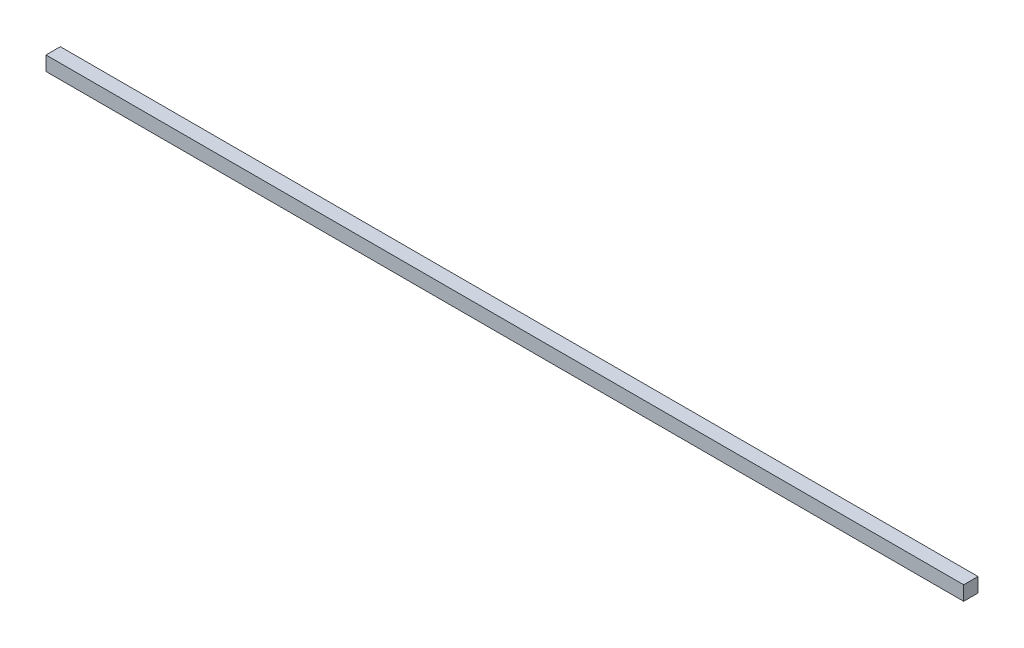
ISO-10303-21;
HEADER;
FILE_DESCRIPTION(('STEP AP214'),'2;1');
FILE_NAME('part.step','',(''),(''),'','','');
FILE_SCHEMA(('AUTOMOTIVE_DESIGN { 1 0 10303 214 1 1 1 1 }'));
ENDSEC;
DATA;
#1=APPLICATION_CONTEXT('core data for automotive mechanical design processes');
#2=APPLICATION_PROTOCOL_DEFINITION('international standard','automotive_design',2000,#1);
#3=PRODUCT_CONTEXT('',#1,'mechanical');
#4=PRODUCT('Part','Part','',(#3));
#5=PRODUCT_RELATED_PRODUCT_CATEGORY('part','',(#4));
#6=PRODUCT_DEFINITION_FORMATION('','',#4);
#7=PRODUCT_DEFINITION_CONTEXT('part definition',#1,'design');
#8=PRODUCT_DEFINITION('design','',#6,#7);
#9=PRODUCT_DEFINITION_SHAPE('','',#8);
#10=(LENGTH_UNIT() NAMED_UNIT(*) SI_UNIT(.MILLI.,.METRE.));
#11=(NAMED_UNIT(*) PLANE_ANGLE_UNIT() SI_UNIT($,.RADIAN.));
#12=(NAMED_UNIT(*) SI_UNIT($,.STERADIAN.) SOLID_ANGLE_UNIT());
#13=UNCERTAINTY_MEASURE_WITH_UNIT(LENGTH_MEASURE(1.E-05),#10,'distance_accuracy_value','');
#14=(GEOMETRIC_REPRESENTATION_CONTEXT(3) GLOBAL_UNCERTAINTY_ASSIGNED_CONTEXT((#13)) GLOBAL_UNIT_ASSIGNED_CONTEXT((#10,
#11,#12)) REPRESENTATION_CONTEXT('',''));
#15=CARTESIAN_POINT('',(0.,0.,0.));
#16=DIRECTION('',(0.,0.,1.));
#17=DIRECTION('',(1.,0.,0.));
#18=AXIS2_PLACEMENT_3D('',#15,#16,#17);
#19=CARTESIAN_POINT('',(-1219.2,19.0500000000001,38.1));
#20=DIRECTION('',(1.,0.,0.));
#21=DIRECTION('',(0.,0.,-1.));
#22=AXIS2_PLACEMENT_3D('',#19,#20,#21);
#23=PLANE('',#22);
#24=DIRECTION('',(0.,-1.,0.));
#25=VECTOR('',#24,1.);
#26=CARTESIAN_POINT('',(-1219.2,19.0500000000001,0.));
#27=LINE('',#26,#25);
#28=CARTESIAN_POINT('',(-1219.2,19.0500000000001,0.));
#29=VERTEX_POINT('',#28);
#30=CARTESIAN_POINT('',(-1219.2,-19.0500000000001,0.));
#31=VERTEX_POINT('',#30);
#32=EDGE_CURVE('E95',#29,#31,#27,.T.);
#33=ORIENTED_EDGE('',*,*,#32,.T.);
#34=DIRECTION('',(0.,0.,-1.));
#35=VECTOR('',#34,1.);
#36=CARTESIAN_POINT('',(-1219.2,-19.0500000000001,38.1));
#37=LINE('',#36,#35);
#38=CARTESIAN_POINT('',(-1219.2,-19.0500000000001,38.1));
#39=VERTEX_POINT('',#38);
#40=EDGE_CURVE('E11',#39,#31,#37,.T.);
#41=ORIENTED_EDGE('',*,*,#40,.F.);
#42=DIRECTION('',(0.,-1.,0.));
#43=VECTOR('',#42,1.);
#44=CARTESIAN_POINT('',(-1219.2,19.0500000000001,38.1));
#45=LINE('',#44,#43);
#46=CARTESIAN_POINT('',(-1219.2,19.0500000000001,38.1));
#47=VERTEX_POINT('',#46);
#48=EDGE_CURVE('E83',#47,#39,#45,.T.);
#49=ORIENTED_EDGE('',*,*,#48,.F.);
#50=DIRECTION('',(0.,0.,-1.));
#51=VECTOR('',#50,1.);
#52=CARTESIAN_POINT('',(-1219.2,19.0500000000001,38.1));
#53=LINE('',#52,#51);
#54=EDGE_CURVE('E91',#47,#29,#53,.T.);
#55=ORIENTED_EDGE('',*,*,#54,.T.);
#56=EDGE_LOOP('',(#33,#41,#49,#55));
#57=FACE_BOUND('',#56,.T.);
#58=ADVANCED_FACE('F32',(#57),#23,.F.);
#59=CARTESIAN_POINT('',(-1219.2,-19.0500000000001,38.1));
#60=DIRECTION('',(0.,1.,0.));
#61=DIRECTION('',(-1.,0.,0.));
#62=AXIS2_PLACEMENT_3D('',#59,#60,#61);
#63=PLANE('',#62);
#64=DIRECTION('',(1.,0.,0.));
#65=VECTOR('',#64,1.);
#66=CARTESIAN_POINT('',(-1219.2,-19.0500000000001,0.));
#67=LINE('',#66,#65);
#68=CARTESIAN_POINT('',(1219.2,-19.05,0.));
#69=VERTEX_POINT('',#68);
#70=EDGE_CURVE('E87',#31,#69,#67,.T.);
#71=ORIENTED_EDGE('',*,*,#70,.T.);
#72=DIRECTION('',(0.,0.,-1.));
#73=VECTOR('',#72,1.);
#74=CARTESIAN_POINT('',(1219.2,-19.05,38.1));
#75=LINE('',#74,#73);
#76=CARTESIAN_POINT('',(1219.2,-19.05,38.1));
#77=VERTEX_POINT('',#76);
#78=EDGE_CURVE('E40',#77,#69,#75,.T.);
#79=ORIENTED_EDGE('',*,*,#78,.F.);
#80=DIRECTION('',(1.,0.,0.));
#81=VECTOR('',#80,1.);
#82=CARTESIAN_POINT('',(-1219.2,-19.0500000000001,38.1));
#83=LINE('',#82,#81);
#84=EDGE_CURVE('E78',#39,#77,#83,.T.);
#85=ORIENTED_EDGE('',*,*,#84,.F.);
#86=ORIENTED_EDGE('',*,*,#40,.T.);
#87=EDGE_LOOP('',(#71,#79,#85,#86));
#88=FACE_BOUND('',#87,.T.);
#89=ADVANCED_FACE('F86',(#88),#63,.F.);
#90=CARTESIAN_POINT('',(1219.2,19.05,38.1));
#91=DIRECTION('',(-1.,0.,0.));
#92=DIRECTION('',(0.,0.,1.));
#93=AXIS2_PLACEMENT_3D('',#90,#91,#92);
#94=PLANE('',#93);
#95=DIRECTION('',(0.,1.,0.));
#96=VECTOR('',#95,1.);
#97=CARTESIAN_POINT('',(1219.2,19.05,0.));
#98=LINE('',#97,#96);
#99=CARTESIAN_POINT('',(1219.2,19.05,0.));
#100=VERTEX_POINT('',#99);
#101=EDGE_CURVE('E65',#69,#100,#98,.T.);
#102=ORIENTED_EDGE('',*,*,#101,.T.);
#103=DIRECTION('',(0.,0.,-1.));
#104=VECTOR('',#103,1.);
#105=CARTESIAN_POINT('',(1219.2,19.05,38.1));
#106=LINE('',#105,#104);
#107=CARTESIAN_POINT('',(1219.2,19.05,38.1));
#108=VERTEX_POINT('',#107);
#109=EDGE_CURVE('E88',#108,#100,#106,.T.);
#110=ORIENTED_EDGE('',*,*,#109,.F.);
#111=DIRECTION('',(0.,1.,0.));
#112=VECTOR('',#111,1.);
#113=CARTESIAN_POINT('',(1219.2,19.05,38.1));
#114=LINE('',#113,#112);
#115=EDGE_CURVE('E81',#77,#108,#114,.T.);
#116=ORIENTED_EDGE('',*,*,#115,.F.);
#117=ORIENTED_EDGE('',*,*,#78,.T.);
#118=EDGE_LOOP('',(#102,#110,#116,#117));
#119=FACE_BOUND('',#118,.T.);
#120=ADVANCED_FACE('F89',(#119),#94,.F.);
#121=CARTESIAN_POINT('',(-1219.2,19.0500000000001,38.1));
#122=DIRECTION('',(0.,-1.,0.));
#123=DIRECTION('',(1.,0.,0.));
#124=AXIS2_PLACEMENT_3D('',#121,#122,#123);
#125=PLANE('',#124);
#126=DIRECTION('',(-1.,0.,0.));
#127=VECTOR('',#126,1.);
#128=CARTESIAN_POINT('',(-1219.2,19.0500000000001,0.));
#129=LINE('',#128,#127);
#130=EDGE_CURVE('E71',#100,#29,#129,.T.);
#131=ORIENTED_EDGE('',*,*,#130,.T.);
#132=ORIENTED_EDGE('',*,*,#54,.F.);
#133=DIRECTION('',(-1.,0.,0.));
#134=VECTOR('',#133,1.);
#135=CARTESIAN_POINT('',(-1219.2,19.0500000000001,38.1));
#136=LINE('',#135,#134);
#137=EDGE_CURVE('E48',#108,#47,#136,.T.);
#138=ORIENTED_EDGE('',*,*,#137,.F.);
#139=ORIENTED_EDGE('',*,*,#109,.T.);
#140=EDGE_LOOP('',(#131,#132,#138,#139));
#141=FACE_BOUND('',#140,.T.);
#142=ADVANCED_FACE('F102',(#141),#125,.F.);
#143=CARTESIAN_POINT('',(0.,0.,38.1));
#144=DIRECTION('',(0.,0.,1.));
#145=DIRECTION('',(1.,0.,0.));
#146=AXIS2_PLACEMENT_3D('',#143,#144,#145);
#147=PLANE('',#146);
#148=ORIENTED_EDGE('',*,*,#48,.T.);
#149=ORIENTED_EDGE('',*,*,#84,.T.);
#150=ORIENTED_EDGE('',*,*,#115,.T.);
#151=ORIENTED_EDGE('',*,*,#137,.T.);
#152=EDGE_LOOP('',(#148,#149,#150,#151));
#153=FACE_BOUND('',#152,.T.);
#154=ADVANCED_FACE('F79',(#153),#147,.T.);
#155=CARTESIAN_POINT('',(0.,0.,0.));
#156=DIRECTION('',(0.,0.,1.));
#157=DIRECTION('',(1.,0.,0.));
#158=AXIS2_PLACEMENT_3D('',#155,#156,#157);
#159=PLANE('',#158);
#160=ORIENTED_EDGE('',*,*,#32,.F.);
#161=ORIENTED_EDGE('',*,*,#130,.F.);
#162=ORIENTED_EDGE('',*,*,#101,.F.);
#163=ORIENTED_EDGE('',*,*,#70,.F.);
#164=EDGE_LOOP('',(#160,#161,#162,#163));
#165=FACE_BOUND('',#164,.T.);
#166=ADVANCED_FACE('F105',(#165),#159,.F.);
#167=CLOSED_SHELL('',(#58,#89,#120,#142,#154,#166));
#168=MANIFOLD_SOLID_BREP('B2',#167);
#169=ADVANCED_BREP_SHAPE_REPRESENTATION('',(#18,#168),#14);
#170=SHAPE_DEFINITION_REPRESENTATION(#9,#169);
ENDSEC;
END-ISO-10303-21;
